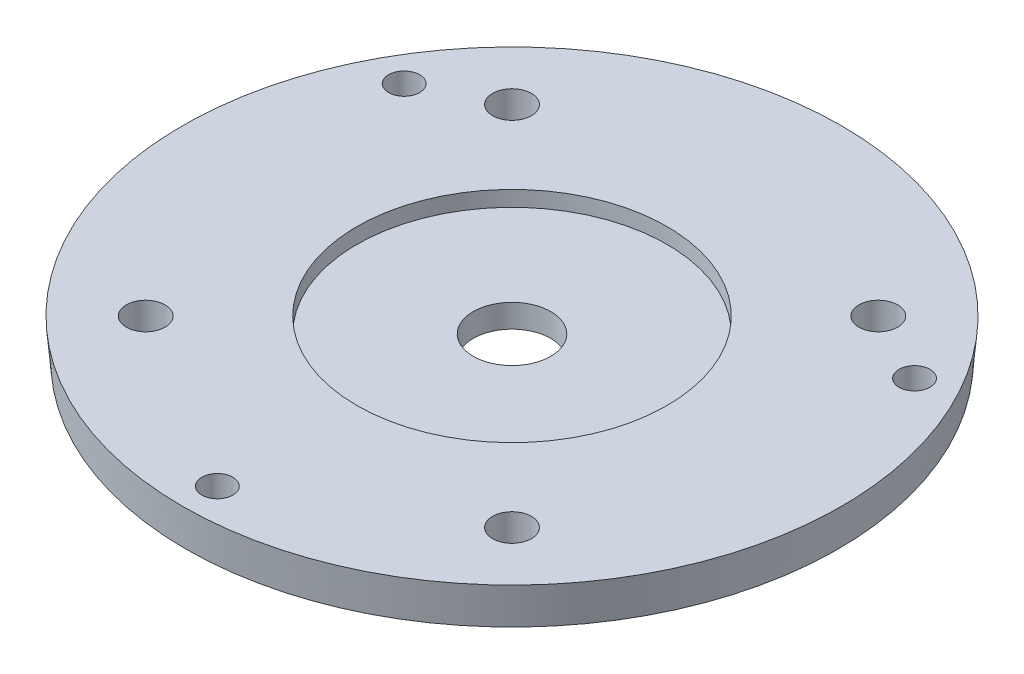
ISO-10303-21;
HEADER;
FILE_DESCRIPTION(('STEP AP214'),'2;1');
FILE_NAME('part.step','',(''),(''),'','','');
FILE_SCHEMA(('AUTOMOTIVE_DESIGN { 1 0 10303 214 1 1 1 1 }'));
ENDSEC;
DATA;
#1=APPLICATION_CONTEXT('core data for automotive mechanical design processes');
#2=APPLICATION_PROTOCOL_DEFINITION('international standard','automotive_design',2000,#1);
#3=PRODUCT_CONTEXT('',#1,'mechanical');
#4=PRODUCT('Part','Part','',(#3));
#5=PRODUCT_RELATED_PRODUCT_CATEGORY('part','',(#4));
#6=PRODUCT_DEFINITION_FORMATION('','',#4);
#7=PRODUCT_DEFINITION_CONTEXT('part definition',#1,'design');
#8=PRODUCT_DEFINITION('design','',#6,#7);
#9=PRODUCT_DEFINITION_SHAPE('','',#8);
#10=(LENGTH_UNIT() NAMED_UNIT(*) SI_UNIT(.MILLI.,.METRE.));
#11=(NAMED_UNIT(*) PLANE_ANGLE_UNIT() SI_UNIT($,.RADIAN.));
#12=(NAMED_UNIT(*) SI_UNIT($,.STERADIAN.) SOLID_ANGLE_UNIT());
#13=UNCERTAINTY_MEASURE_WITH_UNIT(LENGTH_MEASURE(1.E-05),#10,'distance_accuracy_value','');
#14=(GEOMETRIC_REPRESENTATION_CONTEXT(3) GLOBAL_UNCERTAINTY_ASSIGNED_CONTEXT((#13)) GLOBAL_UNIT_ASSIGNED_CONTEXT((#10,
#11,#12)) REPRESENTATION_CONTEXT('',''));
#15=CARTESIAN_POINT('',(0.,0.,0.));
#16=DIRECTION('',(0.,0.,1.));
#17=DIRECTION('',(1.,0.,0.));
#18=AXIS2_PLACEMENT_3D('',#15,#16,#17);
#19=CARTESIAN_POINT('',(0.,-5.,0.));
#20=DIRECTION('',(0.,1.,0.));
#21=DIRECTION('',(0.,0.,1.));
#22=AXIS2_PLACEMENT_3D('',#19,#20,#21);
#23=CYLINDRICAL_SURFACE('',#22,5.);
#24=CARTESIAN_POINT('',(0.,-5.,0.));
#25=DIRECTION('',(0.,1.,0.));
#26=DIRECTION('',(0.,0.,1.));
#27=AXIS2_PLACEMENT_3D('',#24,#25,#26);
#28=CIRCLE('',#27,5.);
#29=CARTESIAN_POINT('',(0.,-5.,4.99999999999999));
#30=VERTEX_POINT('',#29);
#31=EDGE_CURVE('E61',#30,#30,#28,.T.);
#32=ORIENTED_EDGE('',*,*,#31,.F.);
#33=EDGE_LOOP('',(#32));
#34=FACE_BOUND('',#33,.T.);
#35=CARTESIAN_POINT('',(0.,-2.,0.));
#36=DIRECTION('',(0.,1.,0.));
#37=DIRECTION('',(0.,0.,1.));
#38=AXIS2_PLACEMENT_3D('',#35,#36,#37);
#39=CIRCLE('',#38,5.);
#40=CARTESIAN_POINT('',(0.,-2.,4.99999999999999));
#41=VERTEX_POINT('',#40);
#42=EDGE_CURVE('E40',#41,#41,#39,.F.);
#43=ORIENTED_EDGE('',*,*,#42,.F.);
#44=EDGE_LOOP('',(#43));
#45=FACE_BOUND('',#44,.T.);
#46=ADVANCED_FACE('F36',(#34,#45),#23,.F.);
#47=CARTESIAN_POINT('',(0.,0.,0.));
#48=DIRECTION('',(0.,1.,0.));
#49=DIRECTION('',(0.,0.,1.));
#50=AXIS2_PLACEMENT_3D('',#47,#48,#49);
#51=CONICAL_SURFACE('',#50,42.5,0.0872664625997165);
#52=CARTESIAN_POINT('',(0.,-5.,0.));
#53=DIRECTION('',(0.,1.,0.));
#54=DIRECTION('',(0.,0.,1.));
#55=AXIS2_PLACEMENT_3D('',#52,#53,#54);
#56=CIRCLE('',#55,42.0625566823704);
#57=CARTESIAN_POINT('',(0.,-5.,42.0625566823704));
#58=VERTEX_POINT('',#57);
#59=EDGE_CURVE('E10',#58,#58,#56,.T.);
#60=ORIENTED_EDGE('',*,*,#59,.T.);
#61=EDGE_LOOP('',(#60));
#62=FACE_BOUND('',#61,.T.);
#63=CARTESIAN_POINT('',(0.,0.,0.));
#64=DIRECTION('',(0.,1.,0.));
#65=DIRECTION('',(0.,0.,1.));
#66=AXIS2_PLACEMENT_3D('',#63,#64,#65);
#67=CIRCLE('',#66,42.5);
#68=CARTESIAN_POINT('',(0.,0.,42.5));
#69=VERTEX_POINT('',#68);
#70=EDGE_CURVE('E45',#69,#69,#67,.T.);
#71=ORIENTED_EDGE('',*,*,#70,.F.);
#72=EDGE_LOOP('',(#71));
#73=FACE_BOUND('',#72,.T.);
#74=ADVANCED_FACE('F38',(#62,#73),#51,.T.);
#75=CARTESIAN_POINT('',(0.,-5.,0.));
#76=DIRECTION('',(0.,1.,0.));
#77=DIRECTION('',(0.,0.,1.));
#78=AXIS2_PLACEMENT_3D('',#75,#76,#77);
#79=PLANE('',#78);
#80=CARTESIAN_POINT('',(0.,-5.,38.));
#81=DIRECTION('',(0.,1.,0.));
#82=DIRECTION('',(0.,0.,1.));
#83=AXIS2_PLACEMENT_3D('',#80,#81,#82);
#84=CIRCLE('',#83,2.);
#85=CARTESIAN_POINT('',(0.,-5.,40.));
#86=VERTEX_POINT('',#85);
#87=EDGE_CURVE('E93',#86,#86,#84,.F.);
#88=ORIENTED_EDGE('',*,*,#87,.F.);
#89=EDGE_LOOP('',(#88));
#90=FACE_BOUND('',#89,.T.);
#91=CARTESIAN_POINT('',(32.9089653438088,-5.,-18.9999999999997));
#92=DIRECTION('',(0.,1.,0.));
#93=DIRECTION('',(0.,0.,1.));
#94=AXIS2_PLACEMENT_3D('',#91,#92,#93);
#95=CIRCLE('',#94,2.);
#96=CARTESIAN_POINT('',(32.9089653438088,-5.,-16.9999999999997));
#97=VERTEX_POINT('',#96);
#98=EDGE_CURVE('E106',#97,#97,#95,.F.);
#99=ORIENTED_EDGE('',*,*,#98,.F.);
#100=EDGE_LOOP('',(#99));
#101=FACE_BOUND('',#100,.T.);
#102=CARTESIAN_POINT('',(-32.9089653438086,-5.,-19.0000000000002));
#103=DIRECTION('',(0.,1.,0.));
#104=DIRECTION('',(0.,0.,1.));
#105=AXIS2_PLACEMENT_3D('',#102,#103,#104);
#106=CIRCLE('',#105,2.);
#107=CARTESIAN_POINT('',(-32.9089653438086,-5.,-17.0000000000001));
#108=VERTEX_POINT('',#107);
#109=EDGE_CURVE('E97',#108,#108,#106,.F.);
#110=ORIENTED_EDGE('',*,*,#109,.F.);
#111=EDGE_LOOP('',(#110));
#112=FACE_BOUND('',#111,.T.);
#113=ORIENTED_EDGE('',*,*,#31,.T.);
#114=EDGE_LOOP('',(#113));
#115=FACE_BOUND('',#114,.T.);
#116=CARTESIAN_POINT('',(-23.62,-5.,-23.62));
#117=DIRECTION('',(0.,1.,0.));
#118=DIRECTION('',(0.,0.,1.));
#119=AXIS2_PLACEMENT_3D('',#116,#117,#118);
#120=CIRCLE('',#119,2.5);
#121=CARTESIAN_POINT('',(-23.62,-5.,-21.12));
#122=VERTEX_POINT('',#121);
#123=EDGE_CURVE('E69',#122,#122,#120,.T.);
#124=ORIENTED_EDGE('',*,*,#123,.T.);
#125=EDGE_LOOP('',(#124));
#126=FACE_BOUND('',#125,.T.);
#127=CARTESIAN_POINT('',(-23.62,-5.,23.62));
#128=DIRECTION('',(0.,1.,0.));
#129=DIRECTION('',(0.,0.,1.));
#130=AXIS2_PLACEMENT_3D('',#127,#128,#129);
#131=CIRCLE('',#130,2.5);
#132=CARTESIAN_POINT('',(-23.62,-5.,26.12));
#133=VERTEX_POINT('',#132);
#134=EDGE_CURVE('E77',#133,#133,#131,.T.);
#135=ORIENTED_EDGE('',*,*,#134,.T.);
#136=EDGE_LOOP('',(#135));
#137=FACE_BOUND('',#136,.T.);
#138=CARTESIAN_POINT('',(23.62,-5.,23.62));
#139=DIRECTION('',(0.,1.,0.));
#140=DIRECTION('',(0.,0.,1.));
#141=AXIS2_PLACEMENT_3D('',#138,#139,#140);
#142=CIRCLE('',#141,2.5);
#143=CARTESIAN_POINT('',(23.62,-5.,26.12));
#144=VERTEX_POINT('',#143);
#145=EDGE_CURVE('E57',#144,#144,#142,.T.);
#146=ORIENTED_EDGE('',*,*,#145,.T.);
#147=EDGE_LOOP('',(#146));
#148=FACE_BOUND('',#147,.T.);
#149=CARTESIAN_POINT('',(23.62,-5.,-23.62));
#150=DIRECTION('',(0.,1.,0.));
#151=DIRECTION('',(0.,0.,1.));
#152=AXIS2_PLACEMENT_3D('',#149,#150,#151);
#153=CIRCLE('',#152,2.5);
#154=CARTESIAN_POINT('',(23.62,-5.,-21.12));
#155=VERTEX_POINT('',#154);
#156=EDGE_CURVE('E50',#155,#155,#153,.T.);
#157=ORIENTED_EDGE('',*,*,#156,.T.);
#158=EDGE_LOOP('',(#157));
#159=FACE_BOUND('',#158,.T.);
#160=ORIENTED_EDGE('',*,*,#59,.F.);
#161=EDGE_LOOP('',(#160));
#162=FACE_BOUND('',#161,.T.);
#163=ADVANCED_FACE('F127',(#90,#101,#112,#115,#126,#137,#148,#159,#162),#79,.F.);
#164=CARTESIAN_POINT('',(0.,0.,0.));
#165=DIRECTION('',(0.,1.,0.));
#166=DIRECTION('',(0.,0.,1.));
#167=AXIS2_PLACEMENT_3D('',#164,#165,#166);
#168=PLANE('',#167);
#169=CARTESIAN_POINT('',(0.,0.,38.));
#170=DIRECTION('',(0.,1.,0.));
#171=DIRECTION('',(0.,0.,1.));
#172=AXIS2_PLACEMENT_3D('',#169,#170,#171);
#173=CIRCLE('',#172,2.);
#174=CARTESIAN_POINT('',(0.,0.,40.));
#175=VERTEX_POINT('',#174);
#176=EDGE_CURVE('E110',#175,#175,#173,.T.);
#177=ORIENTED_EDGE('',*,*,#176,.F.);
#178=EDGE_LOOP('',(#177));
#179=FACE_BOUND('',#178,.T.);
#180=CARTESIAN_POINT('',(32.9089653438088,0.,-18.9999999999997));
#181=DIRECTION('',(0.,1.,0.));
#182=DIRECTION('',(0.,0.,1.));
#183=AXIS2_PLACEMENT_3D('',#180,#181,#182);
#184=CIRCLE('',#183,2.);
#185=CARTESIAN_POINT('',(32.9089653438088,0.,-16.9999999999997));
#186=VERTEX_POINT('',#185);
#187=EDGE_CURVE('E101',#186,#186,#184,.T.);
#188=ORIENTED_EDGE('',*,*,#187,.F.);
#189=EDGE_LOOP('',(#188));
#190=FACE_BOUND('',#189,.T.);
#191=CARTESIAN_POINT('',(-32.9089653438086,0.,-19.0000000000002));
#192=DIRECTION('',(0.,1.,0.));
#193=DIRECTION('',(0.,0.,1.));
#194=AXIS2_PLACEMENT_3D('',#191,#192,#193);
#195=CIRCLE('',#194,2.);
#196=CARTESIAN_POINT('',(-32.9089653438086,0.,-17.0000000000001));
#197=VERTEX_POINT('',#196);
#198=EDGE_CURVE('E102',#197,#197,#195,.T.);
#199=ORIENTED_EDGE('',*,*,#198,.F.);
#200=EDGE_LOOP('',(#199));
#201=FACE_BOUND('',#200,.T.);
#202=CARTESIAN_POINT('',(0.,0.,0.));
#203=DIRECTION('',(0.,1.,0.));
#204=DIRECTION('',(0.,0.,1.));
#205=AXIS2_PLACEMENT_3D('',#202,#203,#204);
#206=CIRCLE('',#205,20.);
#207=CARTESIAN_POINT('',(0.,0.,20.));
#208=VERTEX_POINT('',#207);
#209=EDGE_CURVE('E88',#208,#208,#206,.T.);
#210=ORIENTED_EDGE('',*,*,#209,.F.);
#211=EDGE_LOOP('',(#210));
#212=FACE_BOUND('',#211,.T.);
#213=CARTESIAN_POINT('',(-23.62,0.,-23.62));
#214=DIRECTION('',(0.,1.,0.));
#215=DIRECTION('',(0.,0.,1.));
#216=AXIS2_PLACEMENT_3D('',#213,#214,#215);
#217=CIRCLE('',#216,2.5);
#218=CARTESIAN_POINT('',(-23.62,0.,-21.12));
#219=VERTEX_POINT('',#218);
#220=EDGE_CURVE('E65',#219,#219,#217,.T.);
#221=ORIENTED_EDGE('',*,*,#220,.F.);
#222=EDGE_LOOP('',(#221));
#223=FACE_BOUND('',#222,.T.);
#224=CARTESIAN_POINT('',(-23.62,0.,23.62));
#225=DIRECTION('',(0.,1.,0.));
#226=DIRECTION('',(0.,0.,1.));
#227=AXIS2_PLACEMENT_3D('',#224,#225,#226);
#228=CIRCLE('',#227,2.5);
#229=CARTESIAN_POINT('',(-23.62,0.,26.12));
#230=VERTEX_POINT('',#229);
#231=EDGE_CURVE('E73',#230,#230,#228,.T.);
#232=ORIENTED_EDGE('',*,*,#231,.F.);
#233=EDGE_LOOP('',(#232));
#234=FACE_BOUND('',#233,.T.);
#235=CARTESIAN_POINT('',(23.62,0.,23.62));
#236=DIRECTION('',(0.,1.,0.));
#237=DIRECTION('',(0.,0.,1.));
#238=AXIS2_PLACEMENT_3D('',#235,#236,#237);
#239=CIRCLE('',#238,2.5);
#240=CARTESIAN_POINT('',(23.62,0.,26.12));
#241=VERTEX_POINT('',#240);
#242=EDGE_CURVE('E81',#241,#241,#239,.T.);
#243=ORIENTED_EDGE('',*,*,#242,.F.);
#244=EDGE_LOOP('',(#243));
#245=FACE_BOUND('',#244,.T.);
#246=CARTESIAN_POINT('',(23.62,0.,-23.62));
#247=DIRECTION('',(0.,1.,0.));
#248=DIRECTION('',(0.,0.,1.));
#249=AXIS2_PLACEMENT_3D('',#246,#247,#248);
#250=CIRCLE('',#249,2.5);
#251=CARTESIAN_POINT('',(23.62,0.,-21.12));
#252=VERTEX_POINT('',#251);
#253=EDGE_CURVE('E53',#252,#252,#250,.T.);
#254=ORIENTED_EDGE('',*,*,#253,.F.);
#255=EDGE_LOOP('',(#254));
#256=FACE_BOUND('',#255,.T.);
#257=ORIENTED_EDGE('',*,*,#70,.T.);
#258=EDGE_LOOP('',(#257));
#259=FACE_BOUND('',#258,.T.);
#260=ADVANCED_FACE('F123',(#179,#190,#201,#212,#223,#234,#245,#256,#259),#168,.T.);
#261=CARTESIAN_POINT('',(23.62,-5.,-23.62));
#262=DIRECTION('',(0.,1.,0.));
#263=DIRECTION('',(0.,0.,1.));
#264=AXIS2_PLACEMENT_3D('',#261,#262,#263);
#265=CYLINDRICAL_SURFACE('',#264,2.5);
#266=ORIENTED_EDGE('',*,*,#156,.F.);
#267=EDGE_LOOP('',(#266));
#268=FACE_BOUND('',#267,.T.);
#269=ORIENTED_EDGE('',*,*,#253,.T.);
#270=EDGE_LOOP('',(#269));
#271=FACE_BOUND('',#270,.T.);
#272=ADVANCED_FACE('F126',(#268,#271),#265,.F.);
#273=CARTESIAN_POINT('',(23.62,-5.,23.62));
#274=DIRECTION('',(0.,1.,0.));
#275=DIRECTION('',(0.,0.,1.));
#276=AXIS2_PLACEMENT_3D('',#273,#274,#275);
#277=CYLINDRICAL_SURFACE('',#276,2.5);
#278=ORIENTED_EDGE('',*,*,#145,.F.);
#279=EDGE_LOOP('',(#278));
#280=FACE_BOUND('',#279,.T.);
#281=ORIENTED_EDGE('',*,*,#242,.T.);
#282=EDGE_LOOP('',(#281));
#283=FACE_BOUND('',#282,.T.);
#284=ADVANCED_FACE('F163',(#280,#283),#277,.F.);
#285=CARTESIAN_POINT('',(-23.62,-5.,23.62));
#286=DIRECTION('',(0.,1.,0.));
#287=DIRECTION('',(0.,0.,1.));
#288=AXIS2_PLACEMENT_3D('',#285,#286,#287);
#289=CYLINDRICAL_SURFACE('',#288,2.5);
#290=ORIENTED_EDGE('',*,*,#134,.F.);
#291=EDGE_LOOP('',(#290));
#292=FACE_BOUND('',#291,.T.);
#293=ORIENTED_EDGE('',*,*,#231,.T.);
#294=EDGE_LOOP('',(#293));
#295=FACE_BOUND('',#294,.T.);
#296=ADVANCED_FACE('F169',(#292,#295),#289,.F.);
#297=CARTESIAN_POINT('',(-23.62,-5.,-23.62));
#298=DIRECTION('',(0.,1.,0.));
#299=DIRECTION('',(0.,0.,1.));
#300=AXIS2_PLACEMENT_3D('',#297,#298,#299);
#301=CYLINDRICAL_SURFACE('',#300,2.5);
#302=ORIENTED_EDGE('',*,*,#123,.F.);
#303=EDGE_LOOP('',(#302));
#304=FACE_BOUND('',#303,.T.);
#305=ORIENTED_EDGE('',*,*,#220,.T.);
#306=EDGE_LOOP('',(#305));
#307=FACE_BOUND('',#306,.T.);
#308=ADVANCED_FACE('F160',(#304,#307),#301,.F.);
#309=CARTESIAN_POINT('',(0.,-2.,0.));
#310=DIRECTION('',(0.,1.,0.));
#311=DIRECTION('',(0.,0.,1.));
#312=AXIS2_PLACEMENT_3D('',#309,#310,#311);
#313=PLANE('',#312);
#314=CARTESIAN_POINT('',(0.,-2.,0.));
#315=DIRECTION('',(0.,1.,0.));
#316=DIRECTION('',(0.,0.,1.));
#317=AXIS2_PLACEMENT_3D('',#314,#315,#316);
#318=CIRCLE('',#317,20.);
#319=CARTESIAN_POINT('',(0.,-2.,20.));
#320=VERTEX_POINT('',#319);
#321=EDGE_CURVE('E92',#320,#320,#318,.T.);
#322=ORIENTED_EDGE('',*,*,#321,.T.);
#323=EDGE_LOOP('',(#322));
#324=FACE_BOUND('',#323,.T.);
#325=ORIENTED_EDGE('',*,*,#42,.T.);
#326=EDGE_LOOP('',(#325));
#327=FACE_BOUND('',#326,.T.);
#328=ADVANCED_FACE('F187',(#324,#327),#313,.T.);
#329=CARTESIAN_POINT('',(0.,-2.,0.));
#330=DIRECTION('',(0.,1.,0.));
#331=DIRECTION('',(0.,0.,1.));
#332=AXIS2_PLACEMENT_3D('',#329,#330,#331);
#333=CYLINDRICAL_SURFACE('',#332,20.);
#334=ORIENTED_EDGE('',*,*,#321,.F.);
#335=EDGE_LOOP('',(#334));
#336=FACE_BOUND('',#335,.T.);
#337=ORIENTED_EDGE('',*,*,#209,.T.);
#338=EDGE_LOOP('',(#337));
#339=FACE_BOUND('',#338,.T.);
#340=ADVANCED_FACE('F183',(#336,#339),#333,.F.);
#341=CARTESIAN_POINT('',(-32.9089653438086,-10.6568542494924,-19.0000000000002));
#342=DIRECTION('',(0.,1.,0.));
#343=DIRECTION('',(0.,0.,1.));
#344=AXIS2_PLACEMENT_3D('',#341,#342,#343);
#345=CYLINDRICAL_SURFACE('',#344,2.);
#346=ORIENTED_EDGE('',*,*,#109,.T.);
#347=EDGE_LOOP('',(#346));
#348=FACE_BOUND('',#347,.T.);
#349=ORIENTED_EDGE('',*,*,#198,.T.);
#350=EDGE_LOOP('',(#349));
#351=FACE_BOUND('',#350,.T.);
#352=ADVANCED_FACE('F186',(#348,#351),#345,.F.);
#353=CARTESIAN_POINT('',(32.9089653438088,-10.6568542494924,-18.9999999999997));
#354=DIRECTION('',(0.,1.,0.));
#355=DIRECTION('',(0.,0.,1.));
#356=AXIS2_PLACEMENT_3D('',#353,#354,#355);
#357=CYLINDRICAL_SURFACE('',#356,2.);
#358=ORIENTED_EDGE('',*,*,#98,.T.);
#359=EDGE_LOOP('',(#358));
#360=FACE_BOUND('',#359,.T.);
#361=ORIENTED_EDGE('',*,*,#187,.T.);
#362=EDGE_LOOP('',(#361));
#363=FACE_BOUND('',#362,.T.);
#364=ADVANCED_FACE('F194',(#360,#363),#357,.F.);
#365=CARTESIAN_POINT('',(0.,-10.6568542494924,38.));
#366=DIRECTION('',(0.,1.,0.));
#367=DIRECTION('',(0.,0.,1.));
#368=AXIS2_PLACEMENT_3D('',#365,#366,#367);
#369=CYLINDRICAL_SURFACE('',#368,2.);
#370=ORIENTED_EDGE('',*,*,#87,.T.);
#371=EDGE_LOOP('',(#370));
#372=FACE_BOUND('',#371,.T.);
#373=ORIENTED_EDGE('',*,*,#176,.T.);
#374=EDGE_LOOP('',(#373));
#375=FACE_BOUND('',#374,.T.);
#376=ADVANCED_FACE('F121',(#372,#375),#369,.F.);
#377=CLOSED_SHELL('',(#46,#74,#163,#260,#272,#284,#296,#308,#328,#340,#352,#364,#376));
#378=MANIFOLD_SOLID_BREP('B2',#377);
#379=ADVANCED_BREP_SHAPE_REPRESENTATION('',(#18,#378),#14);
#380=SHAPE_DEFINITION_REPRESENTATION(#9,#379);
ENDSEC;
END-ISO-10303-21;
